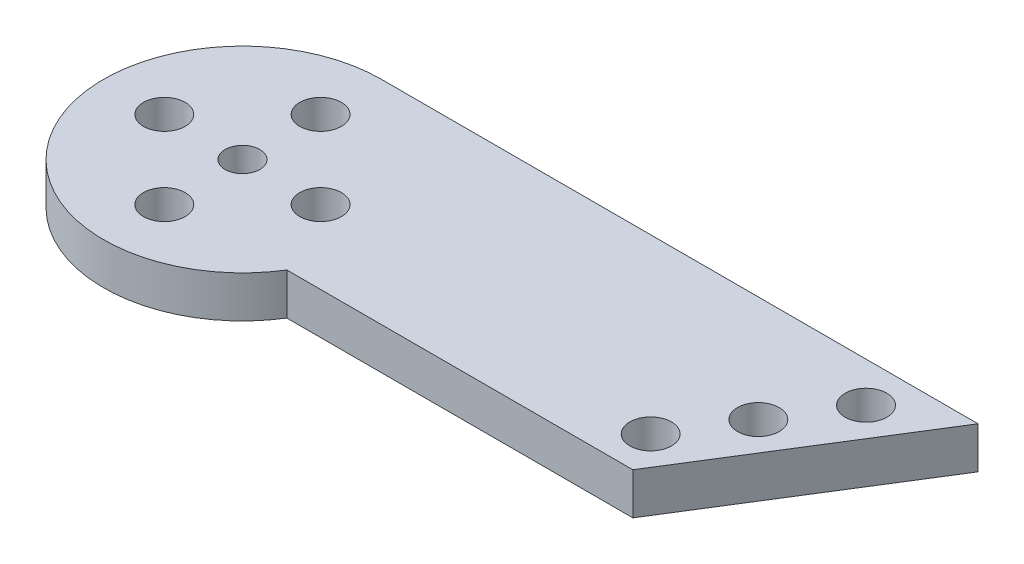
ISO-10303-21;
HEADER;
FILE_DESCRIPTION(('STEP AP214'),'2;1');
FILE_NAME('part.step','',(''),(''),'','','');
FILE_SCHEMA(('AUTOMOTIVE_DESIGN { 1 0 10303 214 1 1 1 1 }'));
ENDSEC;
DATA;
#1=APPLICATION_CONTEXT('core data for automotive mechanical design processes');
#2=APPLICATION_PROTOCOL_DEFINITION('international standard','automotive_design',2000,#1);
#3=PRODUCT_CONTEXT('',#1,'mechanical');
#4=PRODUCT('Part','Part','',(#3));
#5=PRODUCT_RELATED_PRODUCT_CATEGORY('part','',(#4));
#6=PRODUCT_DEFINITION_FORMATION('','',#4);
#7=PRODUCT_DEFINITION_CONTEXT('part definition',#1,'design');
#8=PRODUCT_DEFINITION('design','',#6,#7);
#9=PRODUCT_DEFINITION_SHAPE('','',#8);
#10=(LENGTH_UNIT() NAMED_UNIT(*) SI_UNIT(.MILLI.,.METRE.));
#11=(NAMED_UNIT(*) PLANE_ANGLE_UNIT() SI_UNIT($,.RADIAN.));
#12=(NAMED_UNIT(*) SI_UNIT($,.STERADIAN.) SOLID_ANGLE_UNIT());
#13=UNCERTAINTY_MEASURE_WITH_UNIT(LENGTH_MEASURE(1.E-05),#10,'distance_accuracy_value','');
#14=(GEOMETRIC_REPRESENTATION_CONTEXT(3) GLOBAL_UNCERTAINTY_ASSIGNED_CONTEXT((#13)) GLOBAL_UNIT_ASSIGNED_CONTEXT((#10,
#11,#12)) REPRESENTATION_CONTEXT('',''));
#15=CARTESIAN_POINT('',(0.,0.,0.));
#16=DIRECTION('',(0.,0.,1.));
#17=DIRECTION('',(1.,0.,0.));
#18=AXIS2_PLACEMENT_3D('',#15,#16,#17);
#19=CARTESIAN_POINT('',(-12.1810451847255,2.4,0.));
#20=DIRECTION('',(0.,1.,0.));
#21=DIRECTION('',(0.,0.,1.));
#22=AXIS2_PLACEMENT_3D('',#19,#20,#21);
#23=PLANE('',#22);
#24=CARTESIAN_POINT('',(13.2603716000515,2.4,1.93243286540788));
#25=DIRECTION('',(0.,1.,0.));
#26=DIRECTION('',(0.,0.,1.));
#27=AXIS2_PLACEMENT_3D('',#24,#25,#26);
#28=CIRCLE('',#27,1.2);
#29=CARTESIAN_POINT('',(13.2603716000515,2.4,3.13243286540789));
#30=VERTEX_POINT('',#29);
#31=EDGE_CURVE('E127',#30,#30,#28,.T.);
#32=ORIENTED_EDGE('',*,*,#31,.F.);
#33=EDGE_LOOP('',(#32));
#34=FACE_BOUND('',#33,.T.);
#35=CARTESIAN_POINT('',(-16.6810451847255,2.4,0.));
#36=DIRECTION('',(0.,1.,0.));
#37=DIRECTION('',(0.,0.,1.));
#38=AXIS2_PLACEMENT_3D('',#35,#36,#37);
#39=CIRCLE('',#38,1.2);
#40=CARTESIAN_POINT('',(-16.6810451847255,2.4,1.2));
#41=VERTEX_POINT('',#40);
#42=EDGE_CURVE('E115',#41,#41,#39,.T.);
#43=ORIENTED_EDGE('',*,*,#42,.F.);
#44=EDGE_LOOP('',(#43));
#45=FACE_BOUND('',#44,.T.);
#46=CARTESIAN_POINT('',(-7.68104518472549,2.4,0.));
#47=DIRECTION('',(0.,1.,0.));
#48=DIRECTION('',(0.,0.,1.));
#49=AXIS2_PLACEMENT_3D('',#46,#47,#48);
#50=CIRCLE('',#49,1.2);
#51=CARTESIAN_POINT('',(-7.68104518472549,2.4,1.2));
#52=VERTEX_POINT('',#51);
#53=EDGE_CURVE('E103',#52,#52,#50,.T.);
#54=ORIENTED_EDGE('',*,*,#53,.F.);
#55=EDGE_LOOP('',(#54));
#56=FACE_BOUND('',#55,.T.);
#57=CARTESIAN_POINT('',(-12.1810451847255,2.4,0.));
#58=DIRECTION('',(0.,1.,0.));
#59=DIRECTION('',(0.,0.,1.));
#60=AXIS2_PLACEMENT_3D('',#57,#58,#59);
#61=CIRCLE('',#60,1.);
#62=CARTESIAN_POINT('',(-12.1810451847255,2.4,1.00000000000001));
#63=VERTEX_POINT('',#62);
#64=EDGE_CURVE('E86',#63,#63,#61,.T.);
#65=ORIENTED_EDGE('',*,*,#64,.F.);
#66=EDGE_LOOP('',(#65));
#67=FACE_BOUND('',#66,.T.);
#68=CARTESIAN_POINT('',(-12.1810451847255,2.4,-4.5));
#69=DIRECTION('',(0.,1.,0.));
#70=DIRECTION('',(0.,0.,1.));
#71=AXIS2_PLACEMENT_3D('',#68,#69,#70);
#72=CIRCLE('',#71,1.2);
#73=CARTESIAN_POINT('',(-12.1810451847255,2.4,-3.3));
#74=VERTEX_POINT('',#73);
#75=EDGE_CURVE('E98',#74,#74,#72,.T.);
#76=ORIENTED_EDGE('',*,*,#75,.F.);
#77=EDGE_LOOP('',(#76));
#78=FACE_BOUND('',#77,.T.);
#79=CARTESIAN_POINT('',(-12.1810451847255,2.4,4.5));
#80=DIRECTION('',(0.,1.,0.));
#81=DIRECTION('',(0.,0.,1.));
#82=AXIS2_PLACEMENT_3D('',#79,#80,#81);
#83=CIRCLE('',#82,1.2);
#84=CARTESIAN_POINT('',(-12.1810451847255,2.4,5.7));
#85=VERTEX_POINT('',#84);
#86=EDGE_CURVE('E109',#85,#85,#83,.T.);
#87=ORIENTED_EDGE('',*,*,#86,.F.);
#88=EDGE_LOOP('',(#87));
#89=FACE_BOUND('',#88,.T.);
#90=CARTESIAN_POINT('',(18.0296449781503,2.4,-5.7));
#91=DIRECTION('',(0.,1.,0.));
#92=DIRECTION('',(0.,0.,1.));
#93=AXIS2_PLACEMENT_3D('',#90,#91,#92);
#94=CIRCLE('',#93,1.2);
#95=CARTESIAN_POINT('',(18.0296449781503,2.4,-4.5));
#96=VERTEX_POINT('',#95);
#97=EDGE_CURVE('E121',#96,#96,#94,.T.);
#98=ORIENTED_EDGE('',*,*,#97,.F.);
#99=EDGE_LOOP('',(#98));
#100=FACE_BOUND('',#99,.T.);
#101=CARTESIAN_POINT('',(15.6450082891009,2.4,-1.88378356729606));
#102=DIRECTION('',(0.,1.,0.));
#103=DIRECTION('',(0.,0.,1.));
#104=AXIS2_PLACEMENT_3D('',#101,#102,#103);
#105=CIRCLE('',#104,1.2);
#106=CARTESIAN_POINT('',(15.6450082891009,2.4,-0.683783567296056));
#107=VERTEX_POINT('',#106);
#108=EDGE_CURVE('E133',#107,#107,#105,.T.);
#109=ORIENTED_EDGE('',*,*,#108,.F.);
#110=EDGE_LOOP('',(#109));
#111=FACE_BOUND('',#110,.T.);
#112=CARTESIAN_POINT('',(-12.1810451847255,2.4,0.));
#113=DIRECTION('',(0.,1.,0.));
#114=DIRECTION('',(0.,0.,1.));
#115=AXIS2_PLACEMENT_3D('',#112,#113,#114);
#116=CIRCLE('',#115,8.);
#117=CARTESIAN_POINT('',(-12.1810451847255,2.4,-8.));
#118=VERTEX_POINT('',#117);
#119=CARTESIAN_POINT('',(-5.39234044524719,2.4,4.23243286540789));
#120=VERTEX_POINT('',#119);
#121=EDGE_CURVE('E78',#118,#120,#116,.T.);
#122=ORIENTED_EDGE('',*,*,#121,.T.);
#123=DIRECTION('',(-1.,0.,0.));
#124=VECTOR('',#123,1.);
#125=CARTESIAN_POINT('',(14.5352824183929,2.4,4.23243286540789));
#126=LINE('',#125,#124);
#127=CARTESIAN_POINT('',(14.5352824183929,2.4,4.23243286540789));
#128=VERTEX_POINT('',#127);
#129=EDGE_CURVE('E145',#128,#120,#126,.T.);
#130=ORIENTED_EDGE('',*,*,#129,.F.);
#131=DIRECTION('',(0.529919264233196,0.,-0.848048096156431));
#132=VECTOR('',#131,1.);
#133=CARTESIAN_POINT('',(22.1789548152745,2.4,-8.));
#134=LINE('',#133,#132);
#135=CARTESIAN_POINT('',(22.1789548152745,2.4,-8.));
#136=VERTEX_POINT('',#135);
#137=EDGE_CURVE('E94',#128,#136,#134,.T.);
#138=ORIENTED_EDGE('',*,*,#137,.T.);
#139=DIRECTION('',(-1.,0.,0.));
#140=VECTOR('',#139,1.);
#141=CARTESIAN_POINT('',(-12.1810451847255,2.4,-8.));
#142=LINE('',#141,#140);
#143=EDGE_CURVE('E58',#136,#118,#142,.T.);
#144=ORIENTED_EDGE('',*,*,#143,.T.);
#145=EDGE_LOOP('',(#122,#130,#138,#144));
#146=FACE_BOUND('',#145,.T.);
#147=ADVANCED_FACE('F34',(#34,#45,#56,#67,#78,#89,#100,#111,#146),#23,.T.);
#148=CARTESIAN_POINT('',(-12.1810451847255,0.,0.));
#149=DIRECTION('',(0.,1.,0.));
#150=DIRECTION('',(0.,0.,1.));
#151=AXIS2_PLACEMENT_3D('',#148,#149,#150);
#152=PLANE('',#151);
#153=CARTESIAN_POINT('',(15.6450082891009,0.,-1.88378356729606));
#154=DIRECTION('',(0.,1.,0.));
#155=DIRECTION('',(0.,0.,1.));
#156=AXIS2_PLACEMENT_3D('',#153,#154,#155);
#157=CIRCLE('',#156,1.2);
#158=CARTESIAN_POINT('',(15.6450082891009,0.,-0.683783567296056));
#159=VERTEX_POINT('',#158);
#160=EDGE_CURVE('E136',#159,#159,#157,.T.);
#161=ORIENTED_EDGE('',*,*,#160,.T.);
#162=EDGE_LOOP('',(#161));
#163=FACE_BOUND('',#162,.T.);
#164=CARTESIAN_POINT('',(13.2603716000515,0.,1.93243286540788));
#165=DIRECTION('',(0.,1.,0.));
#166=DIRECTION('',(0.,0.,1.));
#167=AXIS2_PLACEMENT_3D('',#164,#165,#166);
#168=CIRCLE('',#167,1.2);
#169=CARTESIAN_POINT('',(13.2603716000515,0.,3.13243286540789));
#170=VERTEX_POINT('',#169);
#171=EDGE_CURVE('E130',#170,#170,#168,.T.);
#172=ORIENTED_EDGE('',*,*,#171,.T.);
#173=EDGE_LOOP('',(#172));
#174=FACE_BOUND('',#173,.T.);
#175=CARTESIAN_POINT('',(18.0296449781503,0.,-5.7));
#176=DIRECTION('',(0.,1.,0.));
#177=DIRECTION('',(0.,0.,1.));
#178=AXIS2_PLACEMENT_3D('',#175,#176,#177);
#179=CIRCLE('',#178,1.2);
#180=CARTESIAN_POINT('',(18.0296449781503,0.,-4.5));
#181=VERTEX_POINT('',#180);
#182=EDGE_CURVE('E124',#181,#181,#179,.T.);
#183=ORIENTED_EDGE('',*,*,#182,.T.);
#184=EDGE_LOOP('',(#183));
#185=FACE_BOUND('',#184,.T.);
#186=CARTESIAN_POINT('',(-16.6810451847255,0.,0.));
#187=DIRECTION('',(0.,1.,0.));
#188=DIRECTION('',(0.,0.,1.));
#189=AXIS2_PLACEMENT_3D('',#186,#187,#188);
#190=CIRCLE('',#189,1.2);
#191=CARTESIAN_POINT('',(-16.6810451847255,0.,1.2));
#192=VERTEX_POINT('',#191);
#193=EDGE_CURVE('E118',#192,#192,#190,.T.);
#194=ORIENTED_EDGE('',*,*,#193,.T.);
#195=EDGE_LOOP('',(#194));
#196=FACE_BOUND('',#195,.T.);
#197=CARTESIAN_POINT('',(-12.1810451847255,0.,4.5));
#198=DIRECTION('',(0.,1.,0.));
#199=DIRECTION('',(0.,0.,1.));
#200=AXIS2_PLACEMENT_3D('',#197,#198,#199);
#201=CIRCLE('',#200,1.2);
#202=CARTESIAN_POINT('',(-12.1810451847255,0.,5.7));
#203=VERTEX_POINT('',#202);
#204=EDGE_CURVE('E112',#203,#203,#201,.T.);
#205=ORIENTED_EDGE('',*,*,#204,.T.);
#206=EDGE_LOOP('',(#205));
#207=FACE_BOUND('',#206,.T.);
#208=CARTESIAN_POINT('',(-7.68104518472549,0.,0.));
#209=DIRECTION('',(0.,1.,0.));
#210=DIRECTION('',(0.,0.,1.));
#211=AXIS2_PLACEMENT_3D('',#208,#209,#210);
#212=CIRCLE('',#211,1.2);
#213=CARTESIAN_POINT('',(-7.68104518472549,0.,1.2));
#214=VERTEX_POINT('',#213);
#215=EDGE_CURVE('E106',#214,#214,#212,.T.);
#216=ORIENTED_EDGE('',*,*,#215,.T.);
#217=EDGE_LOOP('',(#216));
#218=FACE_BOUND('',#217,.T.);
#219=CARTESIAN_POINT('',(-12.1810451847255,0.,-4.5));
#220=DIRECTION('',(0.,1.,0.));
#221=DIRECTION('',(0.,0.,1.));
#222=AXIS2_PLACEMENT_3D('',#219,#220,#221);
#223=CIRCLE('',#222,1.2);
#224=CARTESIAN_POINT('',(-12.1810451847255,0.,-3.3));
#225=VERTEX_POINT('',#224);
#226=EDGE_CURVE('E100',#225,#225,#223,.T.);
#227=ORIENTED_EDGE('',*,*,#226,.T.);
#228=EDGE_LOOP('',(#227));
#229=FACE_BOUND('',#228,.T.);
#230=CARTESIAN_POINT('',(-12.1810451847255,0.,0.));
#231=DIRECTION('',(0.,1.,0.));
#232=DIRECTION('',(0.,0.,1.));
#233=AXIS2_PLACEMENT_3D('',#230,#231,#232);
#234=CIRCLE('',#233,1.);
#235=CARTESIAN_POINT('',(-12.1810451847255,0.,1.00000000000001));
#236=VERTEX_POINT('',#235);
#237=EDGE_CURVE('E90',#236,#236,#234,.T.);
#238=ORIENTED_EDGE('',*,*,#237,.T.);
#239=EDGE_LOOP('',(#238));
#240=FACE_BOUND('',#239,.T.);
#241=DIRECTION('',(-1.,0.,0.));
#242=VECTOR('',#241,1.);
#243=CARTESIAN_POINT('',(14.5352824183929,0.,4.23243286540789));
#244=LINE('',#243,#242);
#245=CARTESIAN_POINT('',(14.5352824183929,0.,4.23243286540789));
#246=VERTEX_POINT('',#245);
#247=CARTESIAN_POINT('',(-5.39234044524719,0.,4.23243286540789));
#248=VERTEX_POINT('',#247);
#249=EDGE_CURVE('E49',#246,#248,#244,.T.);
#250=ORIENTED_EDGE('',*,*,#249,.T.);
#251=CARTESIAN_POINT('',(-12.1810451847255,0.,0.));
#252=DIRECTION('',(0.,1.,0.));
#253=DIRECTION('',(0.,0.,1.));
#254=AXIS2_PLACEMENT_3D('',#251,#252,#253);
#255=CIRCLE('',#254,8.);
#256=CARTESIAN_POINT('',(-12.1810451847255,0.,-8.));
#257=VERTEX_POINT('',#256);
#258=EDGE_CURVE('E84',#257,#248,#255,.T.);
#259=ORIENTED_EDGE('',*,*,#258,.F.);
#260=DIRECTION('',(-1.,0.,0.));
#261=VECTOR('',#260,1.);
#262=CARTESIAN_POINT('',(-12.1810451847255,0.,-8.));
#263=LINE('',#262,#261);
#264=CARTESIAN_POINT('',(22.1789548152745,0.,-8.));
#265=VERTEX_POINT('',#264);
#266=EDGE_CURVE('E70',#265,#257,#263,.T.);
#267=ORIENTED_EDGE('',*,*,#266,.F.);
#268=DIRECTION('',(0.529919264233196,0.,-0.848048096156431));
#269=VECTOR('',#268,1.);
#270=CARTESIAN_POINT('',(22.1789548152745,0.,-8.));
#271=LINE('',#270,#269);
#272=EDGE_CURVE('E79',#246,#265,#271,.T.);
#273=ORIENTED_EDGE('',*,*,#272,.F.);
#274=EDGE_LOOP('',(#250,#259,#267,#273));
#275=FACE_BOUND('',#274,.T.);
#276=ADVANCED_FACE('F85',(#163,#174,#185,#196,#207,#218,#229,#240,#275),#152,.F.);
#277=CARTESIAN_POINT('',(-12.1810451847255,2.4,0.));
#278=DIRECTION('',(0.,-1.,0.));
#279=DIRECTION('',(0.,0.,-1.));
#280=AXIS2_PLACEMENT_3D('',#277,#278,#279);
#281=CYLINDRICAL_SURFACE('',#280,8.);
#282=ORIENTED_EDGE('',*,*,#258,.T.);
#283=DIRECTION('',(0.,1.,0.));
#284=VECTOR('',#283,1.);
#285=CARTESIAN_POINT('',(-5.39234044524719,0.,4.23243286540789));
#286=LINE('',#285,#284);
#287=EDGE_CURVE('E139',#248,#120,#286,.T.);
#288=ORIENTED_EDGE('',*,*,#287,.T.);
#289=ORIENTED_EDGE('',*,*,#121,.F.);
#290=DIRECTION('',(0.,-1.,0.));
#291=VECTOR('',#290,1.);
#292=CARTESIAN_POINT('',(-12.1810451847255,2.4,-8.));
#293=LINE('',#292,#291);
#294=EDGE_CURVE('E42',#118,#257,#293,.T.);
#295=ORIENTED_EDGE('',*,*,#294,.T.);
#296=EDGE_LOOP('',(#282,#288,#289,#295));
#297=FACE_BOUND('',#296,.T.);
#298=ADVANCED_FACE('F36',(#297),#281,.T.);
#299=CARTESIAN_POINT('',(22.1789548152745,2.4,-8.));
#300=DIRECTION('',(-0.848048096156431,0.,-0.529919264233196));
#301=DIRECTION('',(-0.529919264233196,0.,0.848048096156431));
#302=AXIS2_PLACEMENT_3D('',#299,#300,#301);
#303=PLANE('',#302);
#304=ORIENTED_EDGE('',*,*,#137,.F.);
#305=DIRECTION('',(0.,1.,0.));
#306=VECTOR('',#305,1.);
#307=CARTESIAN_POINT('',(14.5352824183929,0.,4.23243286540789));
#308=LINE('',#307,#306);
#309=EDGE_CURVE('E142',#246,#128,#308,.T.);
#310=ORIENTED_EDGE('',*,*,#309,.F.);
#311=ORIENTED_EDGE('',*,*,#272,.T.);
#312=DIRECTION('',(0.,-1.,0.));
#313=VECTOR('',#312,1.);
#314=CARTESIAN_POINT('',(22.1789548152745,2.4,-8.));
#315=LINE('',#314,#313);
#316=EDGE_CURVE('E11',#136,#265,#315,.T.);
#317=ORIENTED_EDGE('',*,*,#316,.F.);
#318=EDGE_LOOP('',(#304,#310,#311,#317));
#319=FACE_BOUND('',#318,.T.);
#320=ADVANCED_FACE('F155',(#319),#303,.F.);
#321=CARTESIAN_POINT('',(-12.1810451847255,2.4,-8.));
#322=DIRECTION('',(0.,0.,1.));
#323=DIRECTION('',(1.,0.,0.));
#324=AXIS2_PLACEMENT_3D('',#321,#322,#323);
#325=PLANE('',#324);
#326=ORIENTED_EDGE('',*,*,#266,.T.);
#327=ORIENTED_EDGE('',*,*,#294,.F.);
#328=ORIENTED_EDGE('',*,*,#143,.F.);
#329=ORIENTED_EDGE('',*,*,#316,.T.);
#330=EDGE_LOOP('',(#326,#327,#328,#329));
#331=FACE_BOUND('',#330,.T.);
#332=ADVANCED_FACE('F72',(#331),#325,.F.);
#333=CARTESIAN_POINT('',(-12.1810451847255,2.4,0.));
#334=DIRECTION('',(0.,-1.,0.));
#335=DIRECTION('',(0.,0.,-1.));
#336=AXIS2_PLACEMENT_3D('',#333,#334,#335);
#337=CYLINDRICAL_SURFACE('',#336,1.);
#338=ORIENTED_EDGE('',*,*,#64,.T.);
#339=EDGE_LOOP('',(#338));
#340=FACE_BOUND('',#339,.T.);
#341=ORIENTED_EDGE('',*,*,#237,.F.);
#342=EDGE_LOOP('',(#341));
#343=FACE_BOUND('',#342,.T.);
#344=ADVANCED_FACE('F161',(#340,#343),#337,.F.);
#345=CARTESIAN_POINT('',(-12.1810451847255,2.4,-4.5));
#346=DIRECTION('',(0.,-1.,0.));
#347=DIRECTION('',(0.,0.,-1.));
#348=AXIS2_PLACEMENT_3D('',#345,#346,#347);
#349=CYLINDRICAL_SURFACE('',#348,1.2);
#350=ORIENTED_EDGE('',*,*,#75,.T.);
#351=EDGE_LOOP('',(#350));
#352=FACE_BOUND('',#351,.T.);
#353=ORIENTED_EDGE('',*,*,#226,.F.);
#354=EDGE_LOOP('',(#353));
#355=FACE_BOUND('',#354,.T.);
#356=ADVANCED_FACE('F176',(#352,#355),#349,.F.);
#357=CARTESIAN_POINT('',(-7.68104518472549,2.4,0.));
#358=DIRECTION('',(0.,-1.,0.));
#359=DIRECTION('',(0.,0.,-1.));
#360=AXIS2_PLACEMENT_3D('',#357,#358,#359);
#361=CYLINDRICAL_SURFACE('',#360,1.2);
#362=ORIENTED_EDGE('',*,*,#53,.T.);
#363=EDGE_LOOP('',(#362));
#364=FACE_BOUND('',#363,.T.);
#365=ORIENTED_EDGE('',*,*,#215,.F.);
#366=EDGE_LOOP('',(#365));
#367=FACE_BOUND('',#366,.T.);
#368=ADVANCED_FACE('F180',(#364,#367),#361,.F.);
#369=CARTESIAN_POINT('',(-12.1810451847255,2.4,4.5));
#370=DIRECTION('',(0.,-1.,0.));
#371=DIRECTION('',(0.,0.,-1.));
#372=AXIS2_PLACEMENT_3D('',#369,#370,#371);
#373=CYLINDRICAL_SURFACE('',#372,1.2);
#374=ORIENTED_EDGE('',*,*,#86,.T.);
#375=EDGE_LOOP('',(#374));
#376=FACE_BOUND('',#375,.T.);
#377=ORIENTED_EDGE('',*,*,#204,.F.);
#378=EDGE_LOOP('',(#377));
#379=FACE_BOUND('',#378,.T.);
#380=ADVANCED_FACE('F184',(#376,#379),#373,.F.);
#381=CARTESIAN_POINT('',(-16.6810451847255,2.4,0.));
#382=DIRECTION('',(0.,-1.,0.));
#383=DIRECTION('',(0.,0.,-1.));
#384=AXIS2_PLACEMENT_3D('',#381,#382,#383);
#385=CYLINDRICAL_SURFACE('',#384,1.2);
#386=ORIENTED_EDGE('',*,*,#42,.T.);
#387=EDGE_LOOP('',(#386));
#388=FACE_BOUND('',#387,.T.);
#389=ORIENTED_EDGE('',*,*,#193,.F.);
#390=EDGE_LOOP('',(#389));
#391=FACE_BOUND('',#390,.T.);
#392=ADVANCED_FACE('F188',(#388,#391),#385,.F.);
#393=CARTESIAN_POINT('',(18.0296449781503,2.4,-5.7));
#394=DIRECTION('',(0.,-1.,0.));
#395=DIRECTION('',(0.,0.,-1.));
#396=AXIS2_PLACEMENT_3D('',#393,#394,#395);
#397=CYLINDRICAL_SURFACE('',#396,1.2);
#398=ORIENTED_EDGE('',*,*,#97,.T.);
#399=EDGE_LOOP('',(#398));
#400=FACE_BOUND('',#399,.T.);
#401=ORIENTED_EDGE('',*,*,#182,.F.);
#402=EDGE_LOOP('',(#401));
#403=FACE_BOUND('',#402,.T.);
#404=ADVANCED_FACE('F192',(#400,#403),#397,.F.);
#405=CARTESIAN_POINT('',(13.2603716000515,2.4,1.93243286540788));
#406=DIRECTION('',(0.,-1.,0.));
#407=DIRECTION('',(0.,0.,-1.));
#408=AXIS2_PLACEMENT_3D('',#405,#406,#407);
#409=CYLINDRICAL_SURFACE('',#408,1.2);
#410=ORIENTED_EDGE('',*,*,#31,.T.);
#411=EDGE_LOOP('',(#410));
#412=FACE_BOUND('',#411,.T.);
#413=ORIENTED_EDGE('',*,*,#171,.F.);
#414=EDGE_LOOP('',(#413));
#415=FACE_BOUND('',#414,.T.);
#416=ADVANCED_FACE('F196',(#412,#415),#409,.F.);
#417=CARTESIAN_POINT('',(15.6450082891009,2.4,-1.88378356729606));
#418=DIRECTION('',(0.,-1.,0.));
#419=DIRECTION('',(0.,0.,-1.));
#420=AXIS2_PLACEMENT_3D('',#417,#418,#419);
#421=CYLINDRICAL_SURFACE('',#420,1.2);
#422=ORIENTED_EDGE('',*,*,#108,.T.);
#423=EDGE_LOOP('',(#422));
#424=FACE_BOUND('',#423,.T.);
#425=ORIENTED_EDGE('',*,*,#160,.F.);
#426=EDGE_LOOP('',(#425));
#427=FACE_BOUND('',#426,.T.);
#428=ADVANCED_FACE('F200',(#424,#427),#421,.F.);
#429=CARTESIAN_POINT('',(14.5352824183929,0.,4.23243286540789));
#430=DIRECTION('',(0.,0.,-1.));
#431=DIRECTION('',(-1.,0.,0.));
#432=AXIS2_PLACEMENT_3D('',#429,#430,#431);
#433=PLANE('',#432);
#434=ORIENTED_EDGE('',*,*,#129,.T.);
#435=ORIENTED_EDGE('',*,*,#287,.F.);
#436=ORIENTED_EDGE('',*,*,#249,.F.);
#437=ORIENTED_EDGE('',*,*,#309,.T.);
#438=EDGE_LOOP('',(#434,#435,#436,#437));
#439=FACE_BOUND('',#438,.T.);
#440=ADVANCED_FACE('F150',(#439),#433,.F.);
#441=CLOSED_SHELL('',(#147,#276,#298,#320,#332,#344,#356,#368,#380,#392,#404,#416,#428,#440));
#442=MANIFOLD_SOLID_BREP('B2',#441);
#443=ADVANCED_BREP_SHAPE_REPRESENTATION('',(#18,#442),#14);
#444=SHAPE_DEFINITION_REPRESENTATION(#9,#443);
ENDSEC;
END-ISO-10303-21;
